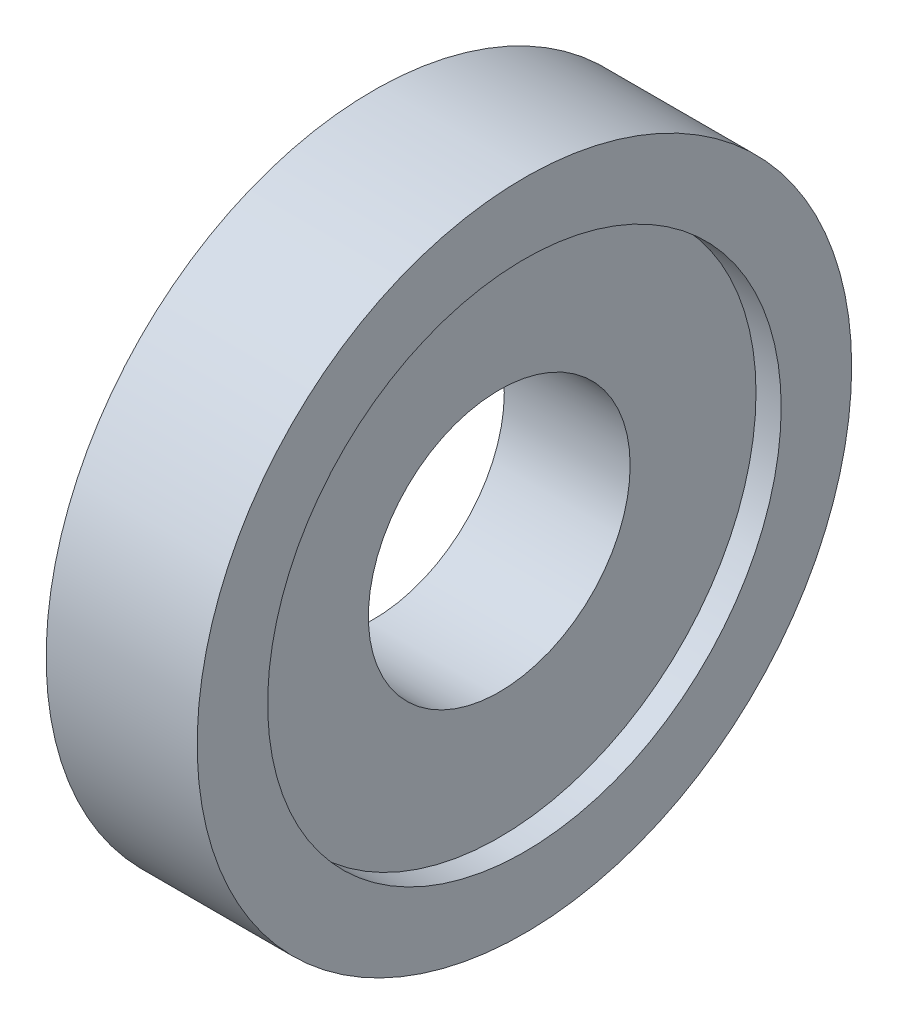
ISO-10303-21;
HEADER;
FILE_DESCRIPTION(('STEP AP214'),'2;1');
FILE_NAME('part.step','',(''),(''),'','','');
FILE_SCHEMA(('AUTOMOTIVE_DESIGN { 1 0 10303 214 1 1 1 1 }'));
ENDSEC;
DATA;
#1=APPLICATION_CONTEXT('core data for automotive mechanical design processes');
#2=APPLICATION_PROTOCOL_DEFINITION('international standard','automotive_design',2000,#1);
#3=PRODUCT_CONTEXT('',#1,'mechanical');
#4=PRODUCT('Part','Part','',(#3));
#5=PRODUCT_RELATED_PRODUCT_CATEGORY('part','',(#4));
#6=PRODUCT_DEFINITION_FORMATION('','',#4);
#7=PRODUCT_DEFINITION_CONTEXT('part definition',#1,'design');
#8=PRODUCT_DEFINITION('design','',#6,#7);
#9=PRODUCT_DEFINITION_SHAPE('','',#8);
#10=(LENGTH_UNIT() NAMED_UNIT(*) SI_UNIT(.MILLI.,.METRE.));
#11=(NAMED_UNIT(*) PLANE_ANGLE_UNIT() SI_UNIT($,.RADIAN.));
#12=(NAMED_UNIT(*) SI_UNIT($,.STERADIAN.) SOLID_ANGLE_UNIT());
#13=UNCERTAINTY_MEASURE_WITH_UNIT(LENGTH_MEASURE(1.E-05),#10,'distance_accuracy_value','');
#14=(GEOMETRIC_REPRESENTATION_CONTEXT(3) GLOBAL_UNCERTAINTY_ASSIGNED_CONTEXT((#13)) GLOBAL_UNIT_ASSIGNED_CONTEXT((#10,
#11,#12)) REPRESENTATION_CONTEXT('',''));
#15=CARTESIAN_POINT('',(0.,0.,0.));
#16=DIRECTION('',(0.,0.,1.));
#17=DIRECTION('',(1.,0.,0.));
#18=AXIS2_PLACEMENT_3D('',#15,#16,#17);
#19=CARTESIAN_POINT('',(3.74603174603175,0.,0.));
#20=DIRECTION('',(1.,0.,0.));
#21=DIRECTION('',(0.,0.,-1.));
#22=AXIS2_PLACEMENT_3D('',#19,#20,#21);
#23=CYLINDRICAL_SURFACE('',#22,2.6);
#24=CARTESIAN_POINT('',(2.5,0.,0.));
#25=DIRECTION('',(1.,0.,0.));
#26=DIRECTION('',(0.,0.,-1.));
#27=AXIS2_PLACEMENT_3D('',#24,#25,#26);
#28=CIRCLE('',#27,2.6);
#29=CARTESIAN_POINT('',(2.5,0.,-2.6));
#30=VERTEX_POINT('',#29);
#31=EDGE_CURVE('E61',#30,#30,#28,.T.);
#32=ORIENTED_EDGE('',*,*,#31,.T.);
#33=EDGE_LOOP('',(#32));
#34=FACE_BOUND('',#33,.T.);
#35=CARTESIAN_POINT('',(0.,0.,0.));
#36=DIRECTION('',(1.,0.,0.));
#37=DIRECTION('',(0.,0.,-1.));
#38=AXIS2_PLACEMENT_3D('',#35,#36,#37);
#39=CIRCLE('',#38,2.6);
#40=CARTESIAN_POINT('',(0.,0.,-2.6));
#41=VERTEX_POINT('',#40);
#42=EDGE_CURVE('E10',#41,#41,#39,.T.);
#43=ORIENTED_EDGE('',*,*,#42,.F.);
#44=EDGE_LOOP('',(#43));
#45=FACE_BOUND('',#44,.T.);
#46=ADVANCED_FACE('F39',(#34,#45),#23,.F.);
#47=CARTESIAN_POINT('',(0.,2.6,0.));
#48=DIRECTION('',(-1.,0.,0.));
#49=DIRECTION('',(0.,0.,1.));
#50=AXIS2_PLACEMENT_3D('',#47,#48,#49);
#51=PLANE('',#50);
#52=ORIENTED_EDGE('',*,*,#42,.T.);
#53=EDGE_LOOP('',(#52));
#54=FACE_BOUND('',#53,.T.);
#55=CARTESIAN_POINT('',(0.,0.,0.));
#56=DIRECTION('',(1.,0.,0.));
#57=DIRECTION('',(0.,0.,-1.));
#58=AXIS2_PLACEMENT_3D('',#55,#56,#57);
#59=CIRCLE('',#58,6.5);
#60=CARTESIAN_POINT('',(0.,0.,-6.5));
#61=VERTEX_POINT('',#60);
#62=EDGE_CURVE('E45',#61,#61,#59,.T.);
#63=ORIENTED_EDGE('',*,*,#62,.F.);
#64=EDGE_LOOP('',(#63));
#65=FACE_BOUND('',#64,.T.);
#66=ADVANCED_FACE('F79',(#54,#65),#51,.T.);
#67=CARTESIAN_POINT('',(3.74603174603175,0.,0.));
#68=DIRECTION('',(1.,0.,0.));
#69=DIRECTION('',(0.,0.,-1.));
#70=AXIS2_PLACEMENT_3D('',#67,#68,#69);
#71=CYLINDRICAL_SURFACE('',#70,6.5);
#72=ORIENTED_EDGE('',*,*,#62,.T.);
#73=EDGE_LOOP('',(#72));
#74=FACE_BOUND('',#73,.T.);
#75=CARTESIAN_POINT('',(3.,0.,0.));
#76=DIRECTION('',(1.,0.,0.));
#77=DIRECTION('',(0.,0.,-1.));
#78=AXIS2_PLACEMENT_3D('',#75,#76,#77);
#79=CIRCLE('',#78,6.5);
#80=CARTESIAN_POINT('',(3.,0.,-6.5));
#81=VERTEX_POINT('',#80);
#82=EDGE_CURVE('E49',#81,#81,#79,.T.);
#83=ORIENTED_EDGE('',*,*,#82,.F.);
#84=EDGE_LOOP('',(#83));
#85=FACE_BOUND('',#84,.T.);
#86=ADVANCED_FACE('F83',(#74,#85),#71,.T.);
#87=CARTESIAN_POINT('',(3.,6.5,0.));
#88=DIRECTION('',(1.,0.,0.));
#89=DIRECTION('',(0.,0.,-1.));
#90=AXIS2_PLACEMENT_3D('',#87,#88,#89);
#91=PLANE('',#90);
#92=ORIENTED_EDGE('',*,*,#82,.T.);
#93=EDGE_LOOP('',(#92));
#94=FACE_BOUND('',#93,.T.);
#95=CARTESIAN_POINT('',(3.,0.,0.));
#96=DIRECTION('',(1.,0.,0.));
#97=DIRECTION('',(0.,0.,-1.));
#98=AXIS2_PLACEMENT_3D('',#95,#96,#97);
#99=CIRCLE('',#98,5.1);
#100=CARTESIAN_POINT('',(3.,0.,-5.1));
#101=VERTEX_POINT('',#100);
#102=EDGE_CURVE('E53',#101,#101,#99,.T.);
#103=ORIENTED_EDGE('',*,*,#102,.F.);
#104=EDGE_LOOP('',(#103));
#105=FACE_BOUND('',#104,.T.);
#106=ADVANCED_FACE('F75',(#94,#105),#91,.T.);
#107=CARTESIAN_POINT('',(3.74603174603175,0.,0.));
#108=DIRECTION('',(1.,0.,0.));
#109=DIRECTION('',(0.,0.,-1.));
#110=AXIS2_PLACEMENT_3D('',#107,#108,#109);
#111=CYLINDRICAL_SURFACE('',#110,5.1);
#112=ORIENTED_EDGE('',*,*,#102,.T.);
#113=EDGE_LOOP('',(#112));
#114=FACE_BOUND('',#113,.T.);
#115=CARTESIAN_POINT('',(2.5,0.,0.));
#116=DIRECTION('',(1.,0.,0.));
#117=DIRECTION('',(0.,0.,-1.));
#118=AXIS2_PLACEMENT_3D('',#115,#116,#117);
#119=CIRCLE('',#118,5.1);
#120=CARTESIAN_POINT('',(2.5,0.,-5.1));
#121=VERTEX_POINT('',#120);
#122=EDGE_CURVE('E58',#121,#121,#119,.T.);
#123=ORIENTED_EDGE('',*,*,#122,.F.);
#124=EDGE_LOOP('',(#123));
#125=FACE_BOUND('',#124,.T.);
#126=ADVANCED_FACE('F69',(#114,#125),#111,.F.);
#127=CARTESIAN_POINT('',(2.5,5.1,0.));
#128=DIRECTION('',(1.,0.,0.));
#129=DIRECTION('',(0.,0.,-1.));
#130=AXIS2_PLACEMENT_3D('',#127,#128,#129);
#131=PLANE('',#130);
#132=ORIENTED_EDGE('',*,*,#122,.T.);
#133=EDGE_LOOP('',(#132));
#134=FACE_BOUND('',#133,.T.);
#135=ORIENTED_EDGE('',*,*,#31,.F.);
#136=EDGE_LOOP('',(#135));
#137=FACE_BOUND('',#136,.T.);
#138=ADVANCED_FACE('F67',(#134,#137),#131,.T.);
#139=CLOSED_SHELL('',(#46,#66,#86,#106,#126,#138));
#140=MANIFOLD_SOLID_BREP('B2',#139);
#141=ADVANCED_BREP_SHAPE_REPRESENTATION('',(#18,#140),#14);
#142=SHAPE_DEFINITION_REPRESENTATION(#9,#141);
ENDSEC;
END-ISO-10303-21;
